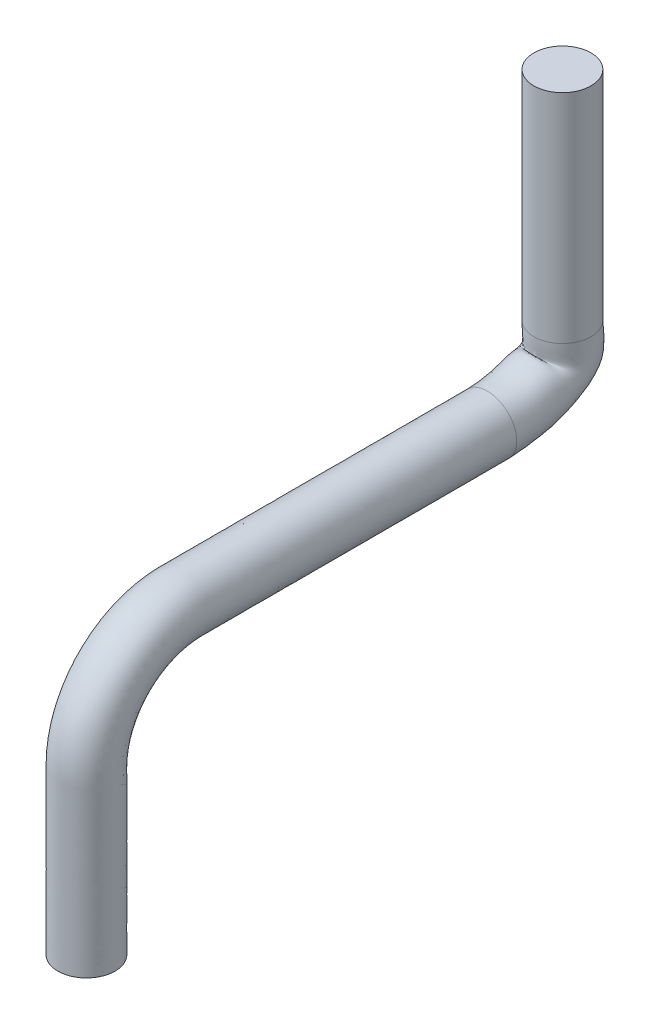
ISO-10303-21;
HEADER;
FILE_DESCRIPTION(('STEP AP214'),'2;1');
FILE_NAME('part.step','',(''),(''),'','','');
FILE_SCHEMA(('AUTOMOTIVE_DESIGN { 1 0 10303 214 1 1 1 1 }'));
ENDSEC;
DATA;
#1=APPLICATION_CONTEXT('core data for automotive mechanical design processes');
#2=APPLICATION_PROTOCOL_DEFINITION('international standard','automotive_design',2000,#1);
#3=PRODUCT_CONTEXT('',#1,'mechanical');
#4=PRODUCT('Part','Part','',(#3));
#5=PRODUCT_RELATED_PRODUCT_CATEGORY('part','',(#4));
#6=PRODUCT_DEFINITION_FORMATION('','',#4);
#7=PRODUCT_DEFINITION_CONTEXT('part definition',#1,'design');
#8=PRODUCT_DEFINITION('design','',#6,#7);
#9=PRODUCT_DEFINITION_SHAPE('','',#8);
#10=(LENGTH_UNIT() NAMED_UNIT(*) SI_UNIT(.MILLI.,.METRE.));
#11=(NAMED_UNIT(*) PLANE_ANGLE_UNIT() SI_UNIT($,.RADIAN.));
#12=(NAMED_UNIT(*) SI_UNIT($,.STERADIAN.) SOLID_ANGLE_UNIT());
#13=UNCERTAINTY_MEASURE_WITH_UNIT(LENGTH_MEASURE(1.E-05),#10,'distance_accuracy_value','');
#14=(GEOMETRIC_REPRESENTATION_CONTEXT(3) GLOBAL_UNCERTAINTY_ASSIGNED_CONTEXT((#13)) GLOBAL_UNIT_ASSIGNED_CONTEXT((#10,
#11,#12)) REPRESENTATION_CONTEXT('',''));
#15=CARTESIAN_POINT('',(0.,0.,0.));
#16=DIRECTION('',(0.,0.,1.));
#17=DIRECTION('',(1.,0.,0.));
#18=AXIS2_PLACEMENT_3D('',#15,#16,#17);
#19=CARTESIAN_POINT('',(0.,-14.0049033725626,14.5019288394946));
#20=DIRECTION('',(0.,1.,0.));
#21=DIRECTION('',(0.,0.,1.));
#22=AXIS2_PLACEMENT_3D('',#19,#20,#21);
#23=PLANE('',#22);
#24=CARTESIAN_POINT('',(0.,-14.0049033725626,14.5019288394946));
#25=DIRECTION('',(0.,-1.,0.));
#26=DIRECTION('',(0.,0.,1.));
#27=AXIS2_PLACEMENT_3D('',#24,#25,#26);
#28=CIRCLE('',#27,1.);
#29=CARTESIAN_POINT('',(0.,-14.0049033725626,15.5019288394946));
#30=VERTEX_POINT('',#29);
#31=EDGE_CURVE('E47',#30,#30,#28,.T.);
#32=ORIENTED_EDGE('',*,*,#31,.T.);
#33=EDGE_LOOP('',(#32));
#34=FACE_BOUND('',#33,.T.);
#35=ADVANCED_FACE('F43',(#34),#23,.F.);
#36=CARTESIAN_POINT('',(0.,4.48672453797011,-2.14583655645663));
#37=DIRECTION('',(0.,1.,0.));
#38=DIRECTION('',(0.,0.,1.));
#39=AXIS2_PLACEMENT_3D('',#36,#37,#38);
#40=PLANE('',#39);
#41=CARTESIAN_POINT('',(0.,4.48672453797011,-2.14583655645663));
#42=DIRECTION('',(0.,1.,0.));
#43=DIRECTION('',(0.,0.,1.));
#44=AXIS2_PLACEMENT_3D('',#41,#42,#43);
#45=CIRCLE('',#44,1.);
#46=CARTESIAN_POINT('',(0.,4.48672453797011,-1.14583655645663));
#47=VERTEX_POINT('',#46);
#48=EDGE_CURVE('E56',#47,#47,#45,.T.);
#49=ORIENTED_EDGE('',*,*,#48,.T.);
#50=EDGE_LOOP('',(#49));
#51=FACE_BOUND('',#50,.T.);
#52=ADVANCED_FACE('F69',(#51),#40,.T.);
#53=CARTESIAN_POINT('',(0.,-3.94736378459204,0.478644744882061));
#54=CARTESIAN_POINT('',(0.,-3.94897296747396,0.526757098047288));
#55=CARTESIAN_POINT('',(0.,-3.94977787681638,0.5767126032183));
#56=CARTESIAN_POINT('',(0.,-3.94978862380982,0.828948889829138));
#57=CARTESIAN_POINT('',(0.,-3.94978014696691,1.06978808872459));
#58=CARTESIAN_POINT('',(0.,-3.94978014696691,4.47819262531349));
#59=CARTESIAN_POINT('',(0.,-3.9497801469669,7.66670009502798));
#60=CARTESIAN_POINT('',(0.,-3.94978014696691,10.9651560981756));
#61=CARTESIAN_POINT('',(0.,-3.94976936150992,11.0585306902316));
#62=CARTESIAN_POINT('',(0.,-3.94979079469478,11.3099599616275));
#63=CARTESIAN_POINT('',(0.,-3.95671646323956,11.4674902073208));
#64=CARTESIAN_POINT('',(0.,-3.98438068624565,11.74849581572));
#65=CARTESIAN_POINT('',(0.,-4.00511089154441,11.8883322223682));
#66=CARTESIAN_POINT('',(0.,-4.08774347492146,12.3039415952074));
#67=CARTESIAN_POINT('',(0.,-4.17017495135789,12.5758132509767));
#68=CARTESIAN_POINT('',(0.,-4.4947983214725,13.3595233937705));
#69=CARTESIAN_POINT('',(0.,-4.81459443093345,13.8379759004497));
#70=CARTESIAN_POINT('',(0.,-5.61373308601006,14.6371145555297));
#71=CARTESIAN_POINT('',(0.,-6.09218559269025,14.9569106649897));
#72=CARTESIAN_POINT('',(0.,-6.87589573548513,15.2815340351032));
#73=CARTESIAN_POINT('',(0.,-7.14776739125438,15.3639655115404));
#74=CARTESIAN_POINT('',(0.,-7.56337676409313,15.4465980949169));
#75=CARTESIAN_POINT('',(0.,-7.70321317074133,15.4673283002157));
#76=CARTESIAN_POINT('',(0.,-7.98421877914087,15.494992523222));
#77=CARTESIAN_POINT('',(0.,-8.14174902483398,15.5019181917667));
#78=CARTESIAN_POINT('',(0.,-8.40422345923209,15.5019405665007));
#79=CARTESIAN_POINT('',(0.,-8.5057494693737,15.5019288394946));
#80=CARTESIAN_POINT('',(0.,-10.4184986530933,15.5019288394946));
#81=CARTESIAN_POINT('',(0.,-12.2117010128286,15.5019288394946));
#82=CARTESIAN_POINT('',(0.,-14.0049033725626,15.5019288394946));
#83=CARTESIAN_POINT('',(2.,-3.94736378459204,0.478644744882061));
#84=CARTESIAN_POINT('',(2.,-3.94897296747395,0.526757098047288));
#85=CARTESIAN_POINT('',(2.,-3.94977787681638,0.576712603218301));
#86=CARTESIAN_POINT('',(2.,-3.94978862380982,0.828948889829138));
#87=CARTESIAN_POINT('',(2.,-3.9497801469669,1.06978808872459));
#88=CARTESIAN_POINT('',(2.,-3.9497801469669,4.47819262531349));
#89=CARTESIAN_POINT('',(2.,-3.9497801469669,7.66670009502798));
#90=CARTESIAN_POINT('',(2.,-3.9497801469669,10.9651560981756));
#91=CARTESIAN_POINT('',(2.,-3.94976936150992,11.0585306902316));
#92=CARTESIAN_POINT('',(2.,-3.94979079469478,11.3099599616275));
#93=CARTESIAN_POINT('',(2.,-3.95671646323955,11.4674902073208));
#94=CARTESIAN_POINT('',(2.,-3.98438068624565,11.74849581572));
#95=CARTESIAN_POINT('',(2.,-4.00511089154441,11.8883322223682));
#96=CARTESIAN_POINT('',(2.,-4.08774347492146,12.3039415952074));
#97=CARTESIAN_POINT('',(2.,-4.17017495135789,12.5758132509767));
#98=CARTESIAN_POINT('',(2.,-4.4947983214725,13.3595233937705));
#99=CARTESIAN_POINT('',(2.,-4.81459443093345,13.8379759004497));
#100=CARTESIAN_POINT('',(2.,-5.61373308601006,14.6371145555297));
#101=CARTESIAN_POINT('',(2.,-6.09218559269025,14.9569106649897));
#102=CARTESIAN_POINT('',(2.,-6.87589573548513,15.2815340351032));
#103=CARTESIAN_POINT('',(2.,-7.14776739125438,15.3639655115404));
#104=CARTESIAN_POINT('',(2.,-7.56337676409313,15.4465980949169));
#105=CARTESIAN_POINT('',(2.,-7.70321317074133,15.4673283002157));
#106=CARTESIAN_POINT('',(2.,-7.98421877914087,15.494992523222));
#107=CARTESIAN_POINT('',(2.,-8.14174902483398,15.5019181917667));
#108=CARTESIAN_POINT('',(2.,-8.40422345923209,15.5019405665007));
#109=CARTESIAN_POINT('',(2.,-8.5057494693737,15.5019288394946));
#110=CARTESIAN_POINT('',(2.,-10.4184986530933,15.5019288394946));
#111=CARTESIAN_POINT('',(2.,-12.2117010128286,15.5019288394946));
#112=CARTESIAN_POINT('',(2.,-14.0049033725626,15.5019288394946));
#113=CARTESIAN_POINT('',(2.,-5.94622667288639,0.427767985963473));
#114=CARTESIAN_POINT('',(2.,-5.94859311830092,0.497563299773625));
#115=CARTESIAN_POINT('',(2.,-5.94977680851032,0.565495445486647));
#116=CARTESIAN_POINT('',(2.,-5.94979261291216,0.870834255203156));
#117=CARTESIAN_POINT('',(2.,-5.94978014696691,1.06978808872459));
#118=CARTESIAN_POINT('',(2.,-5.94978014696691,4.47819262531349));
#119=CARTESIAN_POINT('',(2.,-5.9497801469669,7.66670009502798));
#120=CARTESIAN_POINT('',(2.,-5.94978014696691,10.9651560981756));
#121=CARTESIAN_POINT('',(2.,-5.94977435839093,11.091678834166));
#122=CARTESIAN_POINT('',(2.,-5.9497858616234,11.2772351158867));
#123=CARTESIAN_POINT('',(2.,-5.95350288156819,11.3366376817592));
#124=CARTESIAN_POINT('',(2.,-5.96835032452652,11.4874539450895));
#125=CARTESIAN_POINT('',(2.,-5.97947626652835,11.562504419877));
#126=CARTESIAN_POINT('',(2.,-6.02382533673135,11.7855627886184));
#127=CARTESIAN_POINT('',(2.,-6.06806647244307,11.9314768415876));
#128=CARTESIAN_POINT('',(2.,-6.24229247436988,12.3520956183582));
#129=CARTESIAN_POINT('',(2.,-6.41392767599927,12.6088820207701));
#130=CARTESIAN_POINT('',(2.,-6.84282696569044,13.0377813104631));
#131=CARTESIAN_POINT('',(2.,-7.09961336810307,13.2094165120926));
#132=CARTESIAN_POINT('',(2.,-7.520232144874,13.383642514018));
#133=CARTESIAN_POINT('',(2.,-7.66614619784328,13.4278836497305));
#134=CARTESIAN_POINT('',(2.,-7.88920456658442,13.472232719933));
#135=CARTESIAN_POINT('',(2.,-7.96425504137172,13.483358661935));
#136=CARTESIAN_POINT('',(2.,-8.11507130470258,13.4982061048933));
#137=CARTESIAN_POINT('',(2.,-8.17447387057472,13.5019231248381));
#138=CARTESIAN_POINT('',(2.,-8.36818154758183,13.5019351334019));
#139=CARTESIAN_POINT('',(2.,-8.5057494693737,13.5019288394946));
#140=CARTESIAN_POINT('',(2.,-10.4184986530933,13.5019288394946));
#141=CARTESIAN_POINT('',(2.,-12.2117010128286,13.5019288394946));
#142=CARTESIAN_POINT('',(2.,-14.0049033725626,13.5019288394946));
#143=CARTESIAN_POINT('',(0.,-5.94622667288639,0.427767985963473));
#144=CARTESIAN_POINT('',(0.,-5.94859311830092,0.497563299773625));
#145=CARTESIAN_POINT('',(0.,-5.94977680851032,0.565495445486647));
#146=CARTESIAN_POINT('',(0.,-5.94979261291216,0.870834255203156));
#147=CARTESIAN_POINT('',(0.,-5.94978014696691,1.06978808872459));
#148=CARTESIAN_POINT('',(0.,-5.9497801469669,4.47819262531349));
#149=CARTESIAN_POINT('',(0.,-5.9497801469669,7.66670009502798));
#150=CARTESIAN_POINT('',(0.,-5.94978014696691,10.9651560981756));
#151=CARTESIAN_POINT('',(0.,-5.94977435839093,11.091678834166));
#152=CARTESIAN_POINT('',(0.,-5.9497858616234,11.2772351158867));
#153=CARTESIAN_POINT('',(0.,-5.95350288156819,11.3366376817592));
#154=CARTESIAN_POINT('',(0.,-5.96835032452652,11.4874539450895));
#155=CARTESIAN_POINT('',(0.,-5.97947626652835,11.562504419877));
#156=CARTESIAN_POINT('',(0.,-6.02382533673135,11.7855627886184));
#157=CARTESIAN_POINT('',(0.,-6.06806647244307,11.9314768415876));
#158=CARTESIAN_POINT('',(0.,-6.24229247436988,12.3520956183582));
#159=CARTESIAN_POINT('',(0.,-6.41392767599927,12.6088820207701));
#160=CARTESIAN_POINT('',(0.,-6.84282696569044,13.0377813104631));
#161=CARTESIAN_POINT('',(0.,-7.09961336810307,13.2094165120926));
#162=CARTESIAN_POINT('',(0.,-7.520232144874,13.383642514018));
#163=CARTESIAN_POINT('',(0.,-7.66614619784328,13.4278836497305));
#164=CARTESIAN_POINT('',(0.,-7.88920456658442,13.472232719933));
#165=CARTESIAN_POINT('',(0.,-7.96425504137172,13.483358661935));
#166=CARTESIAN_POINT('',(0.,-8.11507130470258,13.4982061048933));
#167=CARTESIAN_POINT('',(0.,-8.17447387057472,13.5019231248381));
#168=CARTESIAN_POINT('',(0.,-8.36818154758183,13.5019351334018));
#169=CARTESIAN_POINT('',(0.,-8.5057494693737,13.5019288394946));
#170=CARTESIAN_POINT('',(0.,-10.4184986530933,13.5019288394946));
#171=CARTESIAN_POINT('',(0.,-12.2117010128286,13.5019288394946));
#172=CARTESIAN_POINT('',(0.,-14.0049033725626,13.5019288394946));
#173=CARTESIAN_POINT('',(-2.,-5.94622667288639,0.427767985963473));
#174=CARTESIAN_POINT('',(-2.,-5.94859311830092,0.497563299773625));
#175=CARTESIAN_POINT('',(-2.,-5.94977680851032,0.565495445486647));
#176=CARTESIAN_POINT('',(-2.,-5.94979261291216,0.870834255203156));
#177=CARTESIAN_POINT('',(-2.,-5.94978014696691,1.06978808872459));
#178=CARTESIAN_POINT('',(-2.,-5.94978014696691,4.47819262531349));
#179=CARTESIAN_POINT('',(-2.,-5.9497801469669,7.66670009502798));
#180=CARTESIAN_POINT('',(-2.,-5.94978014696691,10.9651560981756));
#181=CARTESIAN_POINT('',(-2.,-5.94977435839093,11.091678834166));
#182=CARTESIAN_POINT('',(-2.,-5.9497858616234,11.2772351158867));
#183=CARTESIAN_POINT('',(-2.,-5.95350288156819,11.3366376817592));
#184=CARTESIAN_POINT('',(-2.,-5.96835032452652,11.4874539450895));
#185=CARTESIAN_POINT('',(-2.,-5.97947626652835,11.562504419877));
#186=CARTESIAN_POINT('',(-2.,-6.02382533673135,11.7855627886184));
#187=CARTESIAN_POINT('',(-2.,-6.06806647244307,11.9314768415876));
#188=CARTESIAN_POINT('',(-2.,-6.24229247436988,12.3520956183582));
#189=CARTESIAN_POINT('',(-2.,-6.41392767599927,12.6088820207701));
#190=CARTESIAN_POINT('',(-2.,-6.84282696569044,13.0377813104631));
#191=CARTESIAN_POINT('',(-2.,-7.09961336810307,13.2094165120926));
#192=CARTESIAN_POINT('',(-2.,-7.520232144874,13.383642514018));
#193=CARTESIAN_POINT('',(-2.,-7.66614619784328,13.4278836497305));
#194=CARTESIAN_POINT('',(-2.,-7.88920456658442,13.472232719933));
#195=CARTESIAN_POINT('',(-2.,-7.96425504137172,13.483358661935));
#196=CARTESIAN_POINT('',(-2.,-8.11507130470258,13.4982061048933));
#197=CARTESIAN_POINT('',(-2.,-8.17447387057472,13.5019231248381));
#198=CARTESIAN_POINT('',(-2.,-8.36818154758183,13.5019351334019));
#199=CARTESIAN_POINT('',(-2.,-8.5057494693737,13.5019288394946));
#200=CARTESIAN_POINT('',(-2.,-10.4184986530933,13.5019288394946));
#201=CARTESIAN_POINT('',(-2.,-12.2117010128286,13.5019288394946));
#202=CARTESIAN_POINT('',(-2.,-14.0049033725626,13.5019288394946));
#203=CARTESIAN_POINT('',(-2.,-3.94736378459204,0.478644744882061));
#204=CARTESIAN_POINT('',(-2.,-3.94897296747395,0.526757098047288));
#205=CARTESIAN_POINT('',(-2.,-3.94977787681638,0.576712603218301));
#206=CARTESIAN_POINT('',(-2.,-3.94978862380982,0.828948889829138));
#207=CARTESIAN_POINT('',(-2.,-3.9497801469669,1.06978808872459));
#208=CARTESIAN_POINT('',(-2.,-3.9497801469669,4.47819262531349));
#209=CARTESIAN_POINT('',(-2.,-3.9497801469669,7.66670009502798));
#210=CARTESIAN_POINT('',(-2.,-3.9497801469669,10.9651560981756));
#211=CARTESIAN_POINT('',(-2.,-3.94976936150992,11.0585306902316));
#212=CARTESIAN_POINT('',(-2.,-3.94979079469478,11.3099599616275));
#213=CARTESIAN_POINT('',(-2.,-3.95671646323955,11.4674902073208));
#214=CARTESIAN_POINT('',(-2.,-3.98438068624565,11.74849581572));
#215=CARTESIAN_POINT('',(-2.,-4.00511089154441,11.8883322223682));
#216=CARTESIAN_POINT('',(-2.,-4.08774347492146,12.3039415952074));
#217=CARTESIAN_POINT('',(-2.,-4.17017495135789,12.5758132509767));
#218=CARTESIAN_POINT('',(-2.,-4.4947983214725,13.3595233937705));
#219=CARTESIAN_POINT('',(-2.,-4.81459443093345,13.8379759004497));
#220=CARTESIAN_POINT('',(-2.,-5.61373308601006,14.6371145555297));
#221=CARTESIAN_POINT('',(-2.,-6.09218559269025,14.9569106649897));
#222=CARTESIAN_POINT('',(-2.,-6.87589573548513,15.2815340351032));
#223=CARTESIAN_POINT('',(-2.,-7.14776739125438,15.3639655115404));
#224=CARTESIAN_POINT('',(-2.,-7.56337676409313,15.4465980949169));
#225=CARTESIAN_POINT('',(-2.,-7.70321317074133,15.4673283002157));
#226=CARTESIAN_POINT('',(-2.,-7.98421877914087,15.494992523222));
#227=CARTESIAN_POINT('',(-2.,-8.14174902483398,15.5019181917667));
#228=CARTESIAN_POINT('',(-2.,-8.40422345923209,15.5019405665007));
#229=CARTESIAN_POINT('',(-2.,-8.5057494693737,15.5019288394946));
#230=CARTESIAN_POINT('',(-2.,-10.4184986530933,15.5019288394946));
#231=CARTESIAN_POINT('',(-2.,-12.2117010128286,15.5019288394946));
#232=CARTESIAN_POINT('',(-2.,-14.0049033725626,15.5019288394946));
#233=CARTESIAN_POINT('',(0.,-3.94736378459204,0.478644744882061));
#234=CARTESIAN_POINT('',(0.,-3.94897296747396,0.526757098047288));
#235=CARTESIAN_POINT('',(0.,-3.94977787681638,0.5767126032183));
#236=CARTESIAN_POINT('',(0.,-3.94978862380982,0.828948889829138));
#237=CARTESIAN_POINT('',(0.,-3.94978014696691,1.06978808872459));
#238=CARTESIAN_POINT('',(0.,-3.94978014696691,4.47819262531349));
#239=CARTESIAN_POINT('',(0.,-3.9497801469669,7.66670009502798));
#240=CARTESIAN_POINT('',(0.,-3.94978014696691,10.9651560981756));
#241=CARTESIAN_POINT('',(0.,-3.94976936150992,11.0585306902316));
#242=CARTESIAN_POINT('',(0.,-3.94979079469478,11.3099599616275));
#243=CARTESIAN_POINT('',(0.,-3.95671646323956,11.4674902073208));
#244=CARTESIAN_POINT('',(0.,-3.98438068624565,11.74849581572));
#245=CARTESIAN_POINT('',(0.,-4.00511089154441,11.8883322223682));
#246=CARTESIAN_POINT('',(0.,-4.08774347492146,12.3039415952074));
#247=CARTESIAN_POINT('',(0.,-4.17017495135789,12.5758132509767));
#248=CARTESIAN_POINT('',(0.,-4.4947983214725,13.3595233937705));
#249=CARTESIAN_POINT('',(0.,-4.81459443093345,13.8379759004497));
#250=CARTESIAN_POINT('',(0.,-5.61373308601006,14.6371145555297));
#251=CARTESIAN_POINT('',(0.,-6.09218559269025,14.9569106649897));
#252=CARTESIAN_POINT('',(0.,-6.87589573548513,15.2815340351032));
#253=CARTESIAN_POINT('',(0.,-7.14776739125438,15.3639655115404));
#254=CARTESIAN_POINT('',(0.,-7.56337676409313,15.4465980949169));
#255=CARTESIAN_POINT('',(0.,-7.70321317074133,15.4673283002157));
#256=CARTESIAN_POINT('',(0.,-7.98421877914087,15.494992523222));
#257=CARTESIAN_POINT('',(0.,-8.14174902483398,15.5019181917667));
#258=CARTESIAN_POINT('',(0.,-8.40422345923209,15.5019405665007));
#259=CARTESIAN_POINT('',(0.,-8.5057494693737,15.5019288394946));
#260=CARTESIAN_POINT('',(0.,-10.4184986530933,15.5019288394946));
#261=CARTESIAN_POINT('',(0.,-12.2117010128286,15.5019288394946));
#262=CARTESIAN_POINT('',(0.,-14.0049033725626,15.5019288394946));
#263=(BOUNDED_SURFACE() B_SPLINE_SURFACE(3,3,((#53,#54,#55,#56,#57,#58,#59,#60,#61,#62,#63,#64,
#65,#66,#67,#68,#69,#70,#71,#72,#73,#74,#75,#76,#77,#78,#79,#80,#81,#82),(#83,#84,#85,#86,#87,
#88,#89,#90,#91,#92,#93,#94,#95,#96,#97,#98,#99,#100,#101,#102,#103,#104,#105,#106,#107,#108,
#109,#110,#111,#112),(#113,#114,#115,#116,#117,#118,#119,#120,#121,#122,#123,#124,#125,#126,
#127,#128,#129,#130,#131,#132,#133,#134,#135,#136,#137,#138,#139,#140,#141,#142),(#143,#144,
#145,#146,#147,#148,#149,#150,#151,#152,#153,#154,#155,#156,#157,#158,#159,#160,#161,#162,#163,
#164,#165,#166,#167,#168,#169,#170,#171,#172),(#173,#174,#175,#176,#177,#178,#179,#180,#181,
#182,#183,#184,#185,#186,#187,#188,#189,#190,#191,#192,#193,#194,#195,#196,#197,#198,#199,#200,
#201,#202),(#203,#204,#205,#206,#207,#208,#209,#210,#211,#212,#213,#214,#215,#216,#217,#218,
#219,#220,#221,#222,#223,#224,#225,#226,#227,#228,#229,#230,#231,#232),(#233,#234,#235,#236,
#237,#238,#239,#240,#241,#242,#243,#244,#245,#246,#247,#248,#249,#250,#251,#252,#253,#254,#255,
#256,#257,#258,#259,#260,#261,#262)),.UNSPECIFIED.,.T.,.F.,.F.) B_SPLINE_SURFACE_WITH_KNOTS((4,
3,4),(4,2,2,2,2,2,2,2,2,2,2,2,2,2,4),(0.,0.5,1.),(0.34336843703513,0.348719270544877,
0.368699520620066,0.658413146710309,0.668403271747904,0.678265823975068,0.688128376202233,
0.707853480656563,0.747303689565221,0.78675389847388,0.80647900292821,0.816341555155375,
0.826204107382539,0.837066350671131,1.),
.UNSPECIFIED.) GEOMETRIC_REPRESENTATION_ITEM() RATIONAL_B_SPLINE_SURFACE(((1.,1.,1.,1.,1.,1.,1.,
1.,1.,1.,1.,1.,1.,1.,1.,1.,1.,1.,1.,1.,1.,1.,1.,1.,1.,1.,1.,1.,1.,1.),(0.333333333333333,
0.333333333333333,0.333333333333333,0.333333333333333,0.333333333333333,0.333333333333333,
0.333333333333333,0.333333333333333,0.333333333333333,0.333333333333333,0.333333333333333,
0.333333333333333,0.333333333333333,0.333333333333333,0.333333333333333,0.333333333333333,
0.333333333333333,0.333333333333333,0.333333333333333,0.333333333333333,0.333333333333333,
0.333333333333333,0.333333333333333,0.333333333333333,0.333333333333333,0.333333333333333,
0.333333333333333,0.333333333333333,0.333333333333333,0.333333333333333),(0.333333333333333,
0.333333333333333,0.333333333333333,0.333333333333333,0.333333333333333,0.333333333333333,
0.333333333333333,0.333333333333333,0.333333333333333,0.333333333333333,0.333333333333333,
0.333333333333333,0.333333333333333,0.333333333333333,0.333333333333333,0.333333333333333,
0.333333333333333,0.333333333333333,0.333333333333333,0.333333333333333,0.333333333333333,
0.333333333333333,0.333333333333333,0.333333333333333,0.333333333333333,0.333333333333333,
0.333333333333333,0.333333333333333,0.333333333333333,0.333333333333333),(1.,1.,1.,1.,1.,1.,1.,
1.,1.,1.,1.,1.,1.,1.,1.,1.,1.,1.,1.,1.,1.,1.,1.,1.,1.,1.,1.,1.,1.,1.),(0.333333333333333,
0.333333333333333,0.333333333333333,0.333333333333333,0.333333333333333,0.333333333333333,
0.333333333333333,0.333333333333333,0.333333333333333,0.333333333333333,0.333333333333333,
0.333333333333333,0.333333333333333,0.333333333333333,0.333333333333333,0.333333333333333,
0.333333333333333,0.333333333333333,0.333333333333333,0.333333333333333,0.333333333333333,
0.333333333333333,0.333333333333333,0.333333333333333,0.333333333333333,0.333333333333333,
0.333333333333333,0.333333333333333,0.333333333333333,0.333333333333333),(0.333333333333333,
0.333333333333333,0.333333333333333,0.333333333333333,0.333333333333333,0.333333333333333,
0.333333333333333,0.333333333333333,0.333333333333333,0.333333333333333,0.333333333333333,
0.333333333333333,0.333333333333333,0.333333333333333,0.333333333333333,0.333333333333333,
0.333333333333333,0.333333333333333,0.333333333333333,0.333333333333333,0.333333333333333,
0.333333333333333,0.333333333333333,0.333333333333333,0.333333333333333,0.333333333333333,
0.333333333333333,0.333333333333333,0.333333333333333,0.333333333333333),(1.,1.,1.,1.,1.,1.,1.,
1.,1.,1.,1.,1.,1.,1.,1.,1.,1.,1.,1.,1.,1.,1.,1.,1.,1.,1.,1.,1.,1.,1.))) REPRESENTATION_ITEM('') SURFACE());
#264=CARTESIAN_POINT('',(0.,-3.94736378459204,0.478644744882061));
#265=CARTESIAN_POINT('',(2.,-3.94736378459204,0.478644744882061));
#266=CARTESIAN_POINT('',(2.,-5.94622667288639,0.427767985963473));
#267=CARTESIAN_POINT('',(0.,-5.94622667288639,0.427767985963473));
#268=CARTESIAN_POINT('',(-2.,-5.94622667288639,0.427767985963473));
#269=CARTESIAN_POINT('',(-2.,-3.94736378459204,0.478644744882061));
#270=CARTESIAN_POINT('',(0.,-3.94736378459204,0.478644744882061));
#271=(BOUNDED_CURVE() B_SPLINE_CURVE(3,(#264,#265,#266,#267,#268,#269,#270),.UNSPECIFIED.,.T.,
.F.) B_SPLINE_CURVE_WITH_KNOTS((4,3,4),(0.,0.5,1.),
.UNSPECIFIED.) CURVE() GEOMETRIC_REPRESENTATION_ITEM() RATIONAL_B_SPLINE_CURVE((1.,
0.333333333333333,0.333333333333333,1.,0.333333333333333,0.333333333333333,1.)) REPRESENTATION_ITEM(''));
#272=CARTESIAN_POINT('',(0.,-3.94736378459204,0.478644744882061));
#273=VERTEX_POINT('',#272);
#274=EDGE_CURVE('E51',#273,#273,#271,.F.);
#275=ORIENTED_EDGE('',*,*,#274,.T.);
#276=EDGE_LOOP('',(#275));
#277=FACE_BOUND('',#276,.T.);
#278=ORIENTED_EDGE('',*,*,#31,.F.);
#279=EDGE_LOOP('',(#278));
#280=FACE_BOUND('',#279,.T.);
#281=ADVANCED_FACE('F67',(#277,#280),#263,.F.);
#282=CARTESIAN_POINT('',(0.,4.48672453797011,-2.14583655645663));
#283=DIRECTION('',(0.,-1.,0.));
#284=DIRECTION('',(1.,0.,0.));
#285=AXIS2_PLACEMENT_3D('',#282,#283,#284);
#286=CYLINDRICAL_SURFACE('',#285,1.);
#287=ORIENTED_EDGE('',*,*,#48,.F.);
#288=EDGE_LOOP('',(#287));
#289=FACE_BOUND('',#288,.T.);
#290=CARTESIAN_POINT('',(0.,-3.11224431624578,-2.14583655645663));
#291=DIRECTION('',(0.,1.,0.));
#292=DIRECTION('',(0.,0.,1.));
#293=AXIS2_PLACEMENT_3D('',#290,#291,#292);
#294=CIRCLE('',#293,1.);
#295=CARTESIAN_POINT('',(0.,-3.11224431624578,-1.14583655645663));
#296=VERTEX_POINT('',#295);
#297=EDGE_CURVE('E11',#296,#296,#294,.T.);
#298=ORIENTED_EDGE('',*,*,#297,.T.);
#299=EDGE_LOOP('',(#298));
#300=FACE_BOUND('',#299,.T.);
#301=ADVANCED_FACE('F45',(#289,#300),#286,.T.);
#302=CARTESIAN_POINT('',(0.,-3.11224431624578,-1.14583655645663));
#303=CARTESIAN_POINT('',(0.,-3.42375125511584,-1.14583655645663));
#304=CARTESIAN_POINT('',(0.,-3.87119823968711,-1.20438791832065));
#305=CARTESIAN_POINT('',(0.,-3.49750207849764,-1.12139562519221));
#306=CARTESIAN_POINT('',(0.,-3.92001436737295,-0.231292729320666));
#307=CARTESIAN_POINT('',(0.,-3.93885175403524,0.224146747851292));
#308=CARTESIAN_POINT('',(0.,-3.94736378459204,0.478644744882061));
#309=CARTESIAN_POINT('',(2.,-3.11224431624578,-1.14583655645663));
#310=CARTESIAN_POINT('',(2.,-3.42375125511585,-1.14583655645663));
#311=CARTESIAN_POINT('',(2.,-3.87119823968711,-1.20438791832065));
#312=CARTESIAN_POINT('',(2.,-3.49750207849764,-1.12139562519221));
#313=CARTESIAN_POINT('',(2.,-3.92001436737295,-0.231292729320665));
#314=CARTESIAN_POINT('',(2.,-3.93885175403523,0.224146747851292));
#315=CARTESIAN_POINT('',(2.,-3.94736378459204,0.478644744882061));
#316=CARTESIAN_POINT('',(2.,-3.11224431624578,-3.14583655645663));
#317=CARTESIAN_POINT('',(2.,-3.42375125511585,-3.14583655645663));
#318=CARTESIAN_POINT('',(2.,-4.43972694378265,-3.43613377094661));
#319=CARTESIAN_POINT('',(2.,-5.66010537977223,-1.57420221564526));
#320=CARTESIAN_POINT('',(2.,-5.7987383590022,-0.753603751700095));
#321=CARTESIAN_POINT('',(2.,-5.93370898089132,0.0585744961789067));
#322=CARTESIAN_POINT('',(2.,-5.94622667288639,0.427767985963473));
#323=CARTESIAN_POINT('',(0.,-3.11224431624578,-3.14583655645663));
#324=CARTESIAN_POINT('',(0.,-3.42375125511584,-3.14583655645663));
#325=CARTESIAN_POINT('',(0.,-4.43972694378265,-3.43613377094661));
#326=CARTESIAN_POINT('',(0.,-5.66010537977223,-1.57420221564526));
#327=CARTESIAN_POINT('',(0.,-5.7987383590022,-0.753603751700094));
#328=CARTESIAN_POINT('',(0.,-5.93370898089131,0.0585744961789066));
#329=CARTESIAN_POINT('',(0.,-5.94622667288639,0.427767985963473));
#330=CARTESIAN_POINT('',(-2.,-3.11224431624578,-3.14583655645663));
#331=CARTESIAN_POINT('',(-2.,-3.42375125511585,-3.14583655645663));
#332=CARTESIAN_POINT('',(-2.,-4.43972694378265,-3.43613377094661));
#333=CARTESIAN_POINT('',(-2.,-5.66010537977223,-1.57420221564526));
#334=CARTESIAN_POINT('',(-2.,-5.7987383590022,-0.753603751700095));
#335=CARTESIAN_POINT('',(-2.,-5.93370898089132,0.0585744961789067));
#336=CARTESIAN_POINT('',(-2.,-5.94622667288639,0.427767985963473));
#337=CARTESIAN_POINT('',(-2.,-3.11224431624578,-1.14583655645663));
#338=CARTESIAN_POINT('',(-2.,-3.42375125511585,-1.14583655645663));
#339=CARTESIAN_POINT('',(-2.,-3.87119823968711,-1.20438791832065));
#340=CARTESIAN_POINT('',(-2.,-3.49750207849764,-1.12139562519221));
#341=CARTESIAN_POINT('',(-2.,-3.92001436737295,-0.231292729320665));
#342=CARTESIAN_POINT('',(-2.,-3.93885175403523,0.224146747851292));
#343=CARTESIAN_POINT('',(-2.,-3.94736378459204,0.478644744882061));
#344=CARTESIAN_POINT('',(0.,-3.11224431624578,-1.14583655645663));
#345=CARTESIAN_POINT('',(0.,-3.42375125511584,-1.14583655645663));
#346=CARTESIAN_POINT('',(0.,-3.87119823968711,-1.20438791832065));
#347=CARTESIAN_POINT('',(0.,-3.49750207849764,-1.12139562519221));
#348=CARTESIAN_POINT('',(0.,-3.92001436737295,-0.231292729320666));
#349=CARTESIAN_POINT('',(0.,-3.93885175403524,0.224146747851292));
#350=CARTESIAN_POINT('',(0.,-3.94736378459204,0.478644744882061));
#351=(BOUNDED_SURFACE() B_SPLINE_SURFACE(3,3,((#302,#303,#304,#305,#306,#307,#308),(#309,#310,
#311,#312,#313,#314,#315),(#316,#317,#318,#319,#320,#321,#322),(#323,#324,#325,#326,#327,#328,
#329),(#330,#331,#332,#333,#334,#335,#336),(#337,#338,#339,#340,#341,#342,#343),(#344,#345,#346,
#347,#348,#349,#350)),.UNSPECIFIED.,.T.,.F.,.F.) B_SPLINE_SURFACE_WITH_KNOTS((4,3,4),(4,1,1,1,
4),(0.,0.5,1.),(0.230152073994304,0.258456164754511,0.286760255514717,0.315064346274924,
0.34336843703513),.UNSPECIFIED.) GEOMETRIC_REPRESENTATION_ITEM() RATIONAL_B_SPLINE_SURFACE(((1.,
1.,1.,1.,1.,1.,1.),(0.333333333333333,0.333333333333333,0.333333333333333,0.333333333333333,
0.333333333333333,0.333333333333333,0.333333333333333),(0.333333333333333,0.333333333333333,
0.333333333333333,0.333333333333333,0.333333333333333,0.333333333333333,0.333333333333333),(1.,
1.,1.,1.,1.,1.,1.),(0.333333333333333,0.333333333333333,0.333333333333333,0.333333333333333,
0.333333333333333,0.333333333333333,0.333333333333333),(0.333333333333333,0.333333333333333,
0.333333333333333,0.333333333333333,0.333333333333333,0.333333333333333,0.333333333333333),(1.,
1.,1.,1.,1.,1.,1.))) REPRESENTATION_ITEM('') SURFACE());
#352=ORIENTED_EDGE('',*,*,#297,.F.);
#353=EDGE_LOOP('',(#352));
#354=FACE_BOUND('',#353,.T.);
#355=ORIENTED_EDGE('',*,*,#274,.F.);
#356=EDGE_LOOP('',(#355));
#357=FACE_BOUND('',#356,.T.);
#358=ADVANCED_FACE('F76',(#354,#357),#351,.F.);
#359=CLOSED_SHELL('',(#35,#52,#281,#301,#358));
#360=MANIFOLD_SOLID_BREP('B2',#359);
#361=ADVANCED_BREP_SHAPE_REPRESENTATION('',(#18,#360),#14);
#362=SHAPE_DEFINITION_REPRESENTATION(#9,#361);
ENDSEC;
END-ISO-10303-21;
